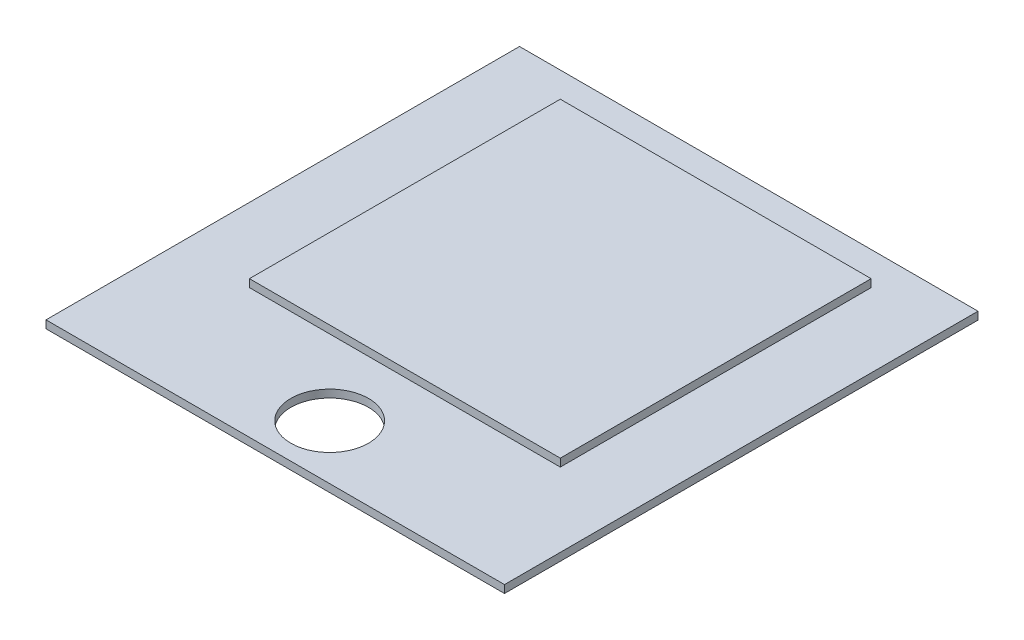
ISO-10303-21;
HEADER;
FILE_DESCRIPTION(('STEP AP214'),'2;1');
FILE_NAME('part.step','',(''),(''),'','','');
FILE_SCHEMA(('AUTOMOTIVE_DESIGN { 1 0 10303 214 1 1 1 1 }'));
ENDSEC;
DATA;
#1=APPLICATION_CONTEXT('core data for automotive mechanical design processes');
#2=APPLICATION_PROTOCOL_DEFINITION('international standard','automotive_design',2000,#1);
#3=PRODUCT_CONTEXT('',#1,'mechanical');
#4=PRODUCT('Part','Part','',(#3));
#5=PRODUCT_RELATED_PRODUCT_CATEGORY('part','',(#4));
#6=PRODUCT_DEFINITION_FORMATION('','',#4);
#7=PRODUCT_DEFINITION_CONTEXT('part definition',#1,'design');
#8=PRODUCT_DEFINITION('design','',#6,#7);
#9=PRODUCT_DEFINITION_SHAPE('','',#8);
#10=(LENGTH_UNIT() NAMED_UNIT(*) SI_UNIT(.MILLI.,.METRE.));
#11=(NAMED_UNIT(*) PLANE_ANGLE_UNIT() SI_UNIT($,.RADIAN.));
#12=(NAMED_UNIT(*) SI_UNIT($,.STERADIAN.) SOLID_ANGLE_UNIT());
#13=UNCERTAINTY_MEASURE_WITH_UNIT(LENGTH_MEASURE(1.E-05),#10,'distance_accuracy_value','');
#14=(GEOMETRIC_REPRESENTATION_CONTEXT(3) GLOBAL_UNCERTAINTY_ASSIGNED_CONTEXT((#13)) GLOBAL_UNIT_ASSIGNED_CONTEXT((#10,
#11,#12)) REPRESENTATION_CONTEXT('',''));
#15=CARTESIAN_POINT('',(0.,0.,0.));
#16=DIRECTION('',(0.,0.,1.));
#17=DIRECTION('',(1.,0.,0.));
#18=AXIS2_PLACEMENT_3D('',#15,#16,#17);
#19=CARTESIAN_POINT('',(0.,10.,0.));
#20=DIRECTION('',(0.,-1.,0.));
#21=DIRECTION('',(0.,0.,-1.));
#22=AXIS2_PLACEMENT_3D('',#19,#20,#21);
#23=PLANE('',#22);
#24=DIRECTION('',(0.,0.,1.));
#25=VECTOR('',#24,1.);
#26=CARTESIAN_POINT('',(-295.,10.,-304.65));
#27=LINE('',#26,#25);
#28=CARTESIAN_POINT('',(-295.,10.,-304.65));
#29=VERTEX_POINT('',#28);
#30=CARTESIAN_POINT('',(-295.,10.,304.65));
#31=VERTEX_POINT('',#30);
#32=EDGE_CURVE('E130',#29,#31,#27,.T.);
#33=ORIENTED_EDGE('',*,*,#32,.T.);
#34=DIRECTION('',(1.,0.,0.));
#35=VECTOR('',#34,1.);
#36=CARTESIAN_POINT('',(295.,10.,304.65));
#37=LINE('',#36,#35);
#38=CARTESIAN_POINT('',(295.,10.,304.65));
#39=VERTEX_POINT('',#38);
#40=EDGE_CURVE('E133',#31,#39,#37,.T.);
#41=ORIENTED_EDGE('',*,*,#40,.T.);
#42=DIRECTION('',(0.,0.,-1.));
#43=VECTOR('',#42,1.);
#44=CARTESIAN_POINT('',(295.,10.,-304.65));
#45=LINE('',#44,#43);
#46=CARTESIAN_POINT('',(295.,10.,-304.65));
#47=VERTEX_POINT('',#46);
#48=EDGE_CURVE('E136',#39,#47,#45,.T.);
#49=ORIENTED_EDGE('',*,*,#48,.T.);
#50=DIRECTION('',(-1.,0.,0.));
#51=VECTOR('',#50,1.);
#52=CARTESIAN_POINT('',(295.,10.,-304.65));
#53=LINE('',#52,#51);
#54=EDGE_CURVE('E138',#47,#29,#53,.T.);
#55=ORIENTED_EDGE('',*,*,#54,.T.);
#56=EDGE_LOOP('',(#33,#41,#49,#55));
#57=FACE_BOUND('',#56,.T.);
#58=CARTESIAN_POINT('',(0.,10.,234.65));
#59=DIRECTION('',(0.,1.,0.));
#60=DIRECTION('',(0.,0.,1.));
#61=AXIS2_PLACEMENT_3D('',#58,#59,#60);
#62=CIRCLE('',#61,50.);
#63=CARTESIAN_POINT('',(0.,10.,284.65));
#64=VERTEX_POINT('',#63);
#65=EDGE_CURVE('E118',#64,#64,#62,.T.);
#66=ORIENTED_EDGE('',*,*,#65,.F.);
#67=EDGE_LOOP('',(#66));
#68=FACE_BOUND('',#67,.T.);
#69=DIRECTION('',(0.,0.,1.));
#70=VECTOR('',#69,1.);
#71=CARTESIAN_POINT('',(-200.,10.,-262.15));
#72=LINE('',#71,#70);
#73=CARTESIAN_POINT('',(-200.,10.,-262.15));
#74=VERTEX_POINT('',#73);
#75=CARTESIAN_POINT('',(-200.,10.,137.85));
#76=VERTEX_POINT('',#75);
#77=EDGE_CURVE('E48',#74,#76,#72,.T.);
#78=ORIENTED_EDGE('',*,*,#77,.F.);
#79=DIRECTION('',(-1.,0.,0.));
#80=VECTOR('',#79,1.);
#81=CARTESIAN_POINT('',(200.,10.,-262.15));
#82=LINE('',#81,#80);
#83=CARTESIAN_POINT('',(200.,10.,-262.15));
#84=VERTEX_POINT('',#83);
#85=EDGE_CURVE('E52',#84,#74,#82,.T.);
#86=ORIENTED_EDGE('',*,*,#85,.F.);
#87=DIRECTION('',(0.,0.,-1.));
#88=VECTOR('',#87,1.);
#89=CARTESIAN_POINT('',(200.,10.,-262.15));
#90=LINE('',#89,#88);
#91=CARTESIAN_POINT('',(200.,10.,137.85));
#92=VERTEX_POINT('',#91);
#93=EDGE_CURVE('E278',#92,#84,#90,.T.);
#94=ORIENTED_EDGE('',*,*,#93,.F.);
#95=DIRECTION('',(1.,0.,0.));
#96=VECTOR('',#95,1.);
#97=CARTESIAN_POINT('',(200.,10.,137.85));
#98=LINE('',#97,#96);
#99=EDGE_CURVE('E284',#76,#92,#98,.T.);
#100=ORIENTED_EDGE('',*,*,#99,.F.);
#101=EDGE_LOOP('',(#78,#86,#94,#100));
#102=FACE_BOUND('',#101,.T.);
#103=ADVANCED_FACE('F33',(#57,#68,#102),#23,.F.);
#104=CARTESIAN_POINT('',(-295.,10.,-304.65));
#105=DIRECTION('',(1.,0.,0.));
#106=DIRECTION('',(0.,0.,-1.));
#107=AXIS2_PLACEMENT_3D('',#104,#105,#106);
#108=PLANE('',#107);
#109=DIRECTION('',(0.,0.,1.));
#110=VECTOR('',#109,1.);
#111=CARTESIAN_POINT('',(-295.,0.,-304.65));
#112=LINE('',#111,#110);
#113=CARTESIAN_POINT('',(-295.,0.,-304.65));
#114=VERTEX_POINT('',#113);
#115=CARTESIAN_POINT('',(-295.,0.,304.65));
#116=VERTEX_POINT('',#115);
#117=EDGE_CURVE('E128',#114,#116,#112,.T.);
#118=ORIENTED_EDGE('',*,*,#117,.T.);
#119=DIRECTION('',(0.,-1.,0.));
#120=VECTOR('',#119,1.);
#121=CARTESIAN_POINT('',(-295.,10.,304.65));
#122=LINE('',#121,#120);
#123=EDGE_CURVE('E11',#31,#116,#122,.T.);
#124=ORIENTED_EDGE('',*,*,#123,.F.);
#125=ORIENTED_EDGE('',*,*,#32,.F.);
#126=DIRECTION('',(0.,-1.,0.));
#127=VECTOR('',#126,1.);
#128=CARTESIAN_POINT('',(-295.,10.,-304.65));
#129=LINE('',#128,#127);
#130=EDGE_CURVE('E140',#29,#114,#129,.T.);
#131=ORIENTED_EDGE('',*,*,#130,.T.);
#132=EDGE_LOOP('',(#118,#124,#125,#131));
#133=FACE_BOUND('',#132,.T.);
#134=ADVANCED_FACE('F35',(#133),#108,.F.);
#135=CARTESIAN_POINT('',(295.,10.,304.65));
#136=DIRECTION('',(0.,0.,-1.));
#137=DIRECTION('',(-1.,0.,0.));
#138=AXIS2_PLACEMENT_3D('',#135,#136,#137);
#139=PLANE('',#138);
#140=DIRECTION('',(1.,0.,0.));
#141=VECTOR('',#140,1.);
#142=CARTESIAN_POINT('',(295.,0.,304.65));
#143=LINE('',#142,#141);
#144=CARTESIAN_POINT('',(295.,0.,304.65));
#145=VERTEX_POINT('',#144);
#146=EDGE_CURVE('E143',#116,#145,#143,.T.);
#147=ORIENTED_EDGE('',*,*,#146,.T.);
#148=DIRECTION('',(0.,-1.,0.));
#149=VECTOR('',#148,1.);
#150=CARTESIAN_POINT('',(295.,10.,304.65));
#151=LINE('',#150,#149);
#152=EDGE_CURVE('E41',#39,#145,#151,.T.);
#153=ORIENTED_EDGE('',*,*,#152,.F.);
#154=ORIENTED_EDGE('',*,*,#40,.F.);
#155=ORIENTED_EDGE('',*,*,#123,.T.);
#156=EDGE_LOOP('',(#147,#153,#154,#155));
#157=FACE_BOUND('',#156,.T.);
#158=ADVANCED_FACE('F173',(#157),#139,.F.);
#159=CARTESIAN_POINT('',(295.,10.,-304.65));
#160=DIRECTION('',(-1.,0.,0.));
#161=DIRECTION('',(0.,0.,1.));
#162=AXIS2_PLACEMENT_3D('',#159,#160,#161);
#163=PLANE('',#162);
#164=DIRECTION('',(0.,0.,-1.));
#165=VECTOR('',#164,1.);
#166=CARTESIAN_POINT('',(295.,0.,-304.65));
#167=LINE('',#166,#165);
#168=CARTESIAN_POINT('',(295.,0.,-304.65));
#169=VERTEX_POINT('',#168);
#170=EDGE_CURVE('E145',#145,#169,#167,.T.);
#171=ORIENTED_EDGE('',*,*,#170,.T.);
#172=DIRECTION('',(0.,-1.,0.));
#173=VECTOR('',#172,1.);
#174=CARTESIAN_POINT('',(295.,10.,-304.65));
#175=LINE('',#174,#173);
#176=EDGE_CURVE('E150',#47,#169,#175,.T.);
#177=ORIENTED_EDGE('',*,*,#176,.F.);
#178=ORIENTED_EDGE('',*,*,#48,.F.);
#179=ORIENTED_EDGE('',*,*,#152,.T.);
#180=EDGE_LOOP('',(#171,#177,#178,#179));
#181=FACE_BOUND('',#180,.T.);
#182=ADVANCED_FACE('F157',(#181),#163,.F.);
#183=CARTESIAN_POINT('',(295.,10.,-304.65));
#184=DIRECTION('',(0.,0.,1.));
#185=DIRECTION('',(1.,0.,0.));
#186=AXIS2_PLACEMENT_3D('',#183,#184,#185);
#187=PLANE('',#186);
#188=DIRECTION('',(-1.,0.,0.));
#189=VECTOR('',#188,1.);
#190=CARTESIAN_POINT('',(295.,0.,-304.65));
#191=LINE('',#190,#189);
#192=EDGE_CURVE('E134',#169,#114,#191,.T.);
#193=ORIENTED_EDGE('',*,*,#192,.T.);
#194=ORIENTED_EDGE('',*,*,#130,.F.);
#195=ORIENTED_EDGE('',*,*,#54,.F.);
#196=ORIENTED_EDGE('',*,*,#176,.T.);
#197=EDGE_LOOP('',(#193,#194,#195,#196));
#198=FACE_BOUND('',#197,.T.);
#199=ADVANCED_FACE('F166',(#198),#187,.F.);
#200=CARTESIAN_POINT('',(0.,0.,0.));
#201=DIRECTION('',(0.,-1.,0.));
#202=DIRECTION('',(0.,0.,-1.));
#203=AXIS2_PLACEMENT_3D('',#200,#201,#202);
#204=PLANE('',#203);
#205=CARTESIAN_POINT('',(0.,0.,234.65));
#206=DIRECTION('',(0.,1.,0.));
#207=DIRECTION('',(0.,0.,1.));
#208=AXIS2_PLACEMENT_3D('',#205,#206,#207);
#209=CIRCLE('',#208,50.);
#210=CARTESIAN_POINT('',(0.,0.,284.65));
#211=VERTEX_POINT('',#210);
#212=EDGE_CURVE('E121',#211,#211,#209,.T.);
#213=ORIENTED_EDGE('',*,*,#212,.T.);
#214=EDGE_LOOP('',(#213));
#215=FACE_BOUND('',#214,.T.);
#216=ORIENTED_EDGE('',*,*,#117,.F.);
#217=ORIENTED_EDGE('',*,*,#192,.F.);
#218=ORIENTED_EDGE('',*,*,#170,.F.);
#219=ORIENTED_EDGE('',*,*,#146,.F.);
#220=EDGE_LOOP('',(#216,#217,#218,#219));
#221=FACE_BOUND('',#220,.T.);
#222=ADVANCED_FACE('F163',(#215,#221),#204,.T.);
#223=CARTESIAN_POINT('',(0.,0.,234.65));
#224=DIRECTION('',(0.,1.,0.));
#225=DIRECTION('',(0.,0.,1.));
#226=AXIS2_PLACEMENT_3D('',#223,#224,#225);
#227=CYLINDRICAL_SURFACE('',#226,50.);
#228=ORIENTED_EDGE('',*,*,#212,.F.);
#229=EDGE_LOOP('',(#228));
#230=FACE_BOUND('',#229,.T.);
#231=ORIENTED_EDGE('',*,*,#65,.T.);
#232=EDGE_LOOP('',(#231));
#233=FACE_BOUND('',#232,.T.);
#234=ADVANCED_FACE('F186',(#230,#233),#227,.F.);
#235=CARTESIAN_POINT('',(-200.,20.,-262.15));
#236=DIRECTION('',(1.,0.,0.));
#237=DIRECTION('',(0.,0.,-1.));
#238=AXIS2_PLACEMENT_3D('',#235,#236,#237);
#239=PLANE('',#238);
#240=ORIENTED_EDGE('',*,*,#77,.T.);
#241=DIRECTION('',(0.,-1.,0.));
#242=VECTOR('',#241,1.);
#243=CARTESIAN_POINT('',(-200.,20.,137.85));
#244=LINE('',#243,#242);
#245=CARTESIAN_POINT('',(-200.,20.,137.85));
#246=VERTEX_POINT('',#245);
#247=EDGE_CURVE('E101',#246,#76,#244,.T.);
#248=ORIENTED_EDGE('',*,*,#247,.F.);
#249=DIRECTION('',(0.,0.,1.));
#250=VECTOR('',#249,1.);
#251=CARTESIAN_POINT('',(-200.,20.,-262.15));
#252=LINE('',#251,#250);
#253=CARTESIAN_POINT('',(-200.,20.,-262.15));
#254=VERTEX_POINT('',#253);
#255=EDGE_CURVE('E107',#254,#246,#252,.T.);
#256=ORIENTED_EDGE('',*,*,#255,.F.);
#257=DIRECTION('',(0.,-1.,0.));
#258=VECTOR('',#257,1.);
#259=CARTESIAN_POINT('',(-200.,20.,-262.15));
#260=LINE('',#259,#258);
#261=EDGE_CURVE('E276',#254,#74,#260,.T.);
#262=ORIENTED_EDGE('',*,*,#261,.T.);
#263=EDGE_LOOP('',(#240,#248,#256,#262));
#264=FACE_BOUND('',#263,.T.);
#265=ADVANCED_FACE('F117',(#264),#239,.F.);
#266=CARTESIAN_POINT('',(200.,20.,137.85));
#267=DIRECTION('',(0.,0.,-1.));
#268=DIRECTION('',(-1.,0.,0.));
#269=AXIS2_PLACEMENT_3D('',#266,#267,#268);
#270=PLANE('',#269);
#271=ORIENTED_EDGE('',*,*,#99,.T.);
#272=DIRECTION('',(0.,-1.,0.));
#273=VECTOR('',#272,1.);
#274=CARTESIAN_POINT('',(200.,20.,137.85));
#275=LINE('',#274,#273);
#276=CARTESIAN_POINT('',(200.,20.,137.85));
#277=VERTEX_POINT('',#276);
#278=EDGE_CURVE('E103',#277,#92,#275,.T.);
#279=ORIENTED_EDGE('',*,*,#278,.F.);
#280=DIRECTION('',(1.,0.,0.));
#281=VECTOR('',#280,1.);
#282=CARTESIAN_POINT('',(200.,20.,137.85));
#283=LINE('',#282,#281);
#284=EDGE_CURVE('E96',#246,#277,#283,.T.);
#285=ORIENTED_EDGE('',*,*,#284,.F.);
#286=ORIENTED_EDGE('',*,*,#247,.T.);
#287=EDGE_LOOP('',(#271,#279,#285,#286));
#288=FACE_BOUND('',#287,.T.);
#289=ADVANCED_FACE('F99',(#288),#270,.F.);
#290=CARTESIAN_POINT('',(200.,20.,-262.15));
#291=DIRECTION('',(-1.,0.,0.));
#292=DIRECTION('',(0.,0.,1.));
#293=AXIS2_PLACEMENT_3D('',#290,#291,#292);
#294=PLANE('',#293);
#295=ORIENTED_EDGE('',*,*,#93,.T.);
#296=DIRECTION('',(0.,-1.,0.));
#297=VECTOR('',#296,1.);
#298=CARTESIAN_POINT('',(200.,20.,-262.15));
#299=LINE('',#298,#297);
#300=CARTESIAN_POINT('',(200.,20.,-262.15));
#301=VERTEX_POINT('',#300);
#302=EDGE_CURVE('E123',#301,#84,#299,.T.);
#303=ORIENTED_EDGE('',*,*,#302,.F.);
#304=DIRECTION('',(0.,0.,-1.));
#305=VECTOR('',#304,1.);
#306=CARTESIAN_POINT('',(200.,20.,-262.15));
#307=LINE('',#306,#305);
#308=EDGE_CURVE('E106',#277,#301,#307,.T.);
#309=ORIENTED_EDGE('',*,*,#308,.F.);
#310=ORIENTED_EDGE('',*,*,#278,.T.);
#311=EDGE_LOOP('',(#295,#303,#309,#310));
#312=FACE_BOUND('',#311,.T.);
#313=ADVANCED_FACE('F217',(#312),#294,.F.);
#314=CARTESIAN_POINT('',(200.,20.,-262.15));
#315=DIRECTION('',(0.,0.,1.));
#316=DIRECTION('',(1.,0.,0.));
#317=AXIS2_PLACEMENT_3D('',#314,#315,#316);
#318=PLANE('',#317);
#319=ORIENTED_EDGE('',*,*,#85,.T.);
#320=ORIENTED_EDGE('',*,*,#261,.F.);
#321=DIRECTION('',(-1.,0.,0.));
#322=VECTOR('',#321,1.);
#323=CARTESIAN_POINT('',(200.,20.,-262.15));
#324=LINE('',#323,#322);
#325=EDGE_CURVE('E112',#301,#254,#324,.T.);
#326=ORIENTED_EDGE('',*,*,#325,.F.);
#327=ORIENTED_EDGE('',*,*,#302,.T.);
#328=EDGE_LOOP('',(#319,#320,#326,#327));
#329=FACE_BOUND('',#328,.T.);
#330=ADVANCED_FACE('F224',(#329),#318,.F.);
#331=CARTESIAN_POINT('',(0.,20.,0.));
#332=DIRECTION('',(0.,-1.,0.));
#333=DIRECTION('',(0.,0.,-1.));
#334=AXIS2_PLACEMENT_3D('',#331,#332,#333);
#335=PLANE('',#334);
#336=ORIENTED_EDGE('',*,*,#255,.T.);
#337=ORIENTED_EDGE('',*,*,#284,.T.);
#338=ORIENTED_EDGE('',*,*,#308,.T.);
#339=ORIENTED_EDGE('',*,*,#325,.T.);
#340=EDGE_LOOP('',(#336,#337,#338,#339));
#341=FACE_BOUND('',#340,.T.);
#342=ADVANCED_FACE('F110',(#341),#335,.F.);
#343=CLOSED_SHELL('',(#103,#134,#158,#182,#199,#222,#234,#265,#289,#313,#330,#342));
#344=MANIFOLD_SOLID_BREP('B2',#343);
#345=ADVANCED_BREP_SHAPE_REPRESENTATION('',(#18,#344),#14);
#346=SHAPE_DEFINITION_REPRESENTATION(#9,#345);
ENDSEC;
END-ISO-10303-21;
